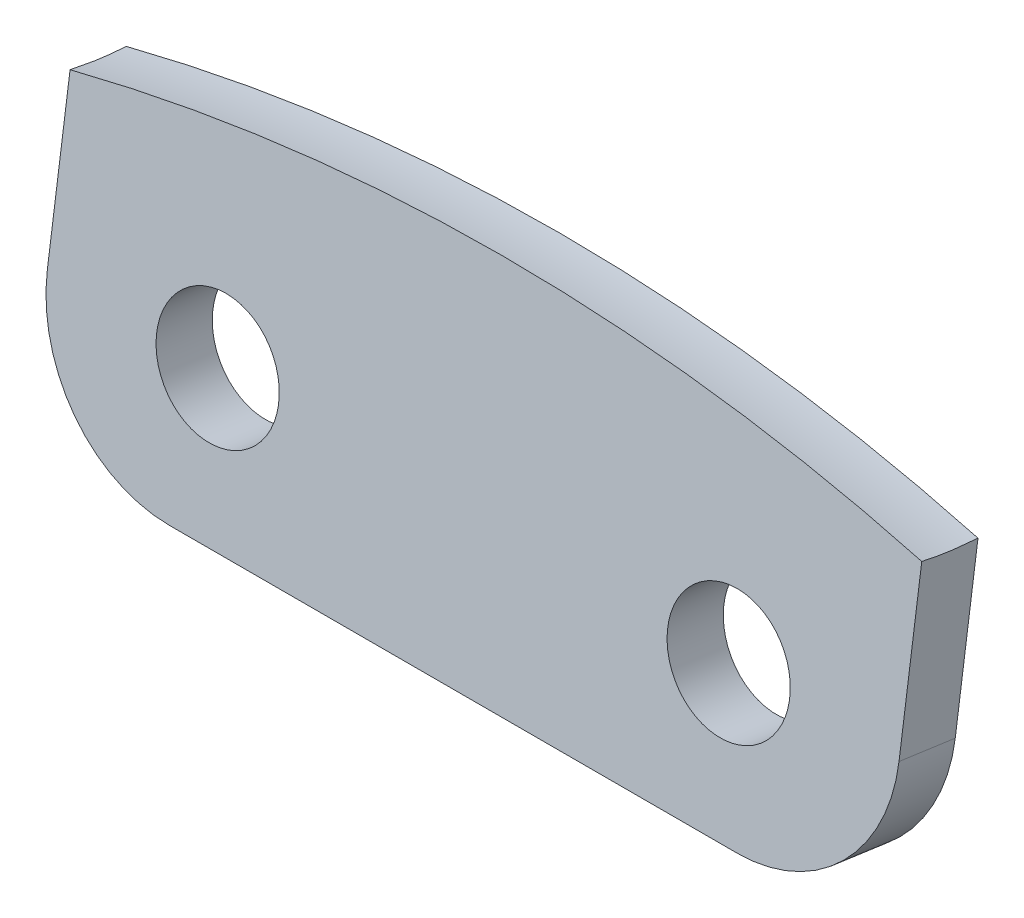
ISO-10303-21;
HEADER;
FILE_DESCRIPTION(('STEP AP214'),'2;1');
FILE_NAME('part.step','',(''),(''),'','','');
FILE_SCHEMA(('AUTOMOTIVE_DESIGN { 1 0 10303 214 1 1 1 1 }'));
ENDSEC;
DATA;
#1=APPLICATION_CONTEXT('core data for automotive mechanical design processes');
#2=APPLICATION_PROTOCOL_DEFINITION('international standard','automotive_design',2000,#1);
#3=PRODUCT_CONTEXT('',#1,'mechanical');
#4=PRODUCT('Part','Part','',(#3));
#5=PRODUCT_RELATED_PRODUCT_CATEGORY('part','',(#4));
#6=PRODUCT_DEFINITION_FORMATION('','',#4);
#7=PRODUCT_DEFINITION_CONTEXT('part definition',#1,'design');
#8=PRODUCT_DEFINITION('design','',#6,#7);
#9=PRODUCT_DEFINITION_SHAPE('','',#8);
#10=(LENGTH_UNIT() NAMED_UNIT(*) SI_UNIT(.MILLI.,.METRE.));
#11=(NAMED_UNIT(*) PLANE_ANGLE_UNIT() SI_UNIT($,.RADIAN.));
#12=(NAMED_UNIT(*) SI_UNIT($,.STERADIAN.) SOLID_ANGLE_UNIT());
#13=UNCERTAINTY_MEASURE_WITH_UNIT(LENGTH_MEASURE(1.E-05),#10,'distance_accuracy_value','');
#14=(GEOMETRIC_REPRESENTATION_CONTEXT(3) GLOBAL_UNCERTAINTY_ASSIGNED_CONTEXT((#13)) GLOBAL_UNIT_ASSIGNED_CONTEXT((#10,
#11,#12)) REPRESENTATION_CONTEXT('',''));
#15=CARTESIAN_POINT('',(0.,0.,0.));
#16=DIRECTION('',(0.,0.,1.));
#17=DIRECTION('',(1.,0.,0.));
#18=AXIS2_PLACEMENT_3D('',#15,#16,#17);
#19=CARTESIAN_POINT('',(-9.99999999999947,1160.19792613936,-1535.82954968714));
#20=DIRECTION('',(0.,-0.139147477143419,-0.990271669596087));
#21=DIRECTION('',(0.,0.990271669596087,-0.139147477143419));
#22=AXIS2_PLACEMENT_3D('',#19,#20,#21);
#23=CYLINDRICAL_SURFACE('',#22,4.99999999999995);
#24=DIRECTION('',(0.,-0.139147477143419,-0.990271669596087));
#25=VECTOR('',#24,1.);
#26=CARTESIAN_POINT('',(-14.9999999999995,1160.19792613936,-1535.82954968714));
#27=LINE('',#26,#25);
#28=CARTESIAN_POINT('',(-14.9999999999995,1160.19792613936,-1535.82954968714));
#29=VERTEX_POINT('',#28);
#30=CARTESIAN_POINT('',(-14.9999999999995,1159.91963118507,-1537.81009302633));
#31=VERTEX_POINT('',#30);
#32=EDGE_CURVE('E44',#29,#31,#27,.T.);
#33=ORIENTED_EDGE('',*,*,#32,.T.);
#34=CARTESIAN_POINT('',(-9.99999999999947,1159.91963118507,-1537.81009302633));
#35=DIRECTION('',(0.,-0.139147477143419,-0.990271669596087));
#36=DIRECTION('',(0.,-0.990271669596087,0.139147477143419));
#37=AXIS2_PLACEMENT_3D('',#34,#35,#36);
#38=CIRCLE('',#37,4.99999999999995);
#39=CARTESIAN_POINT('',(-9.99999999999947,1154.96827283709,-1537.11435564061));
#40=VERTEX_POINT('',#39);
#41=EDGE_CURVE('E102',#40,#31,#38,.T.);
#42=ORIENTED_EDGE('',*,*,#41,.F.);
#43=DIRECTION('',(0.,-0.139147477143419,-0.990271669596087));
#44=VECTOR('',#43,1.);
#45=CARTESIAN_POINT('',(-9.99999999999947,1155.24656779138,-1535.13381230142));
#46=LINE('',#45,#44);
#47=CARTESIAN_POINT('',(-9.99999999999947,1155.24656779138,-1535.13381230142));
#48=VERTEX_POINT('',#47);
#49=EDGE_CURVE('E127',#48,#40,#46,.T.);
#50=ORIENTED_EDGE('',*,*,#49,.F.);
#51=CARTESIAN_POINT('',(-9.99999999999947,1160.19792613936,-1535.82954968714));
#52=DIRECTION('',(0.,-0.139147477143419,-0.990271669596087));
#53=DIRECTION('',(0.,-0.990271669596087,0.139147477143419));
#54=AXIS2_PLACEMENT_3D('',#51,#52,#53);
#55=CIRCLE('',#54,4.99999999999995);
#56=EDGE_CURVE('E122',#48,#29,#55,.T.);
#57=ORIENTED_EDGE('',*,*,#56,.T.);
#58=EDGE_LOOP('',(#33,#42,#50,#57));
#59=FACE_BOUND('',#58,.T.);
#60=ADVANCED_FACE('F35',(#59),#23,.T.);
#61=CARTESIAN_POINT('',(-9.99999999999947,1155.24656779138,-1535.13381230142));
#62=DIRECTION('',(0.,-0.990271669596087,0.139147477143419));
#63=DIRECTION('',(0.,-0.139147477143419,-0.990271669596087));
#64=AXIS2_PLACEMENT_3D('',#61,#62,#63);
#65=PLANE('',#64);
#66=ORIENTED_EDGE('',*,*,#49,.T.);
#67=DIRECTION('',(-1.,0.,0.));
#68=VECTOR('',#67,1.);
#69=CARTESIAN_POINT('',(-9.99999999999947,1154.96827283709,-1537.11435564061));
#70=LINE('',#69,#68);
#71=CARTESIAN_POINT('',(10.0000000000005,1154.96827283709,-1537.11435564061));
#72=VERTEX_POINT('',#71);
#73=EDGE_CURVE('E108',#72,#40,#70,.T.);
#74=ORIENTED_EDGE('',*,*,#73,.F.);
#75=DIRECTION('',(0.,-0.139147477143419,-0.990271669596087));
#76=VECTOR('',#75,1.);
#77=CARTESIAN_POINT('',(10.0000000000005,1155.24656779138,-1535.13381230142));
#78=LINE('',#77,#76);
#79=CARTESIAN_POINT('',(10.0000000000005,1155.24656779138,-1535.13381230142));
#80=VERTEX_POINT('',#79);
#81=EDGE_CURVE('E129',#80,#72,#78,.T.);
#82=ORIENTED_EDGE('',*,*,#81,.F.);
#83=DIRECTION('',(-1.,0.,0.));
#84=VECTOR('',#83,1.);
#85=CARTESIAN_POINT('',(-9.99999999999947,1155.24656779138,-1535.13381230142));
#86=LINE('',#85,#84);
#87=EDGE_CURVE('E119',#80,#48,#86,.T.);
#88=ORIENTED_EDGE('',*,*,#87,.T.);
#89=EDGE_LOOP('',(#66,#74,#82,#88));
#90=FACE_BOUND('',#89,.T.);
#91=ADVANCED_FACE('F184',(#90),#65,.T.);
#92=CARTESIAN_POINT('',(10.0000000000005,1160.19792613936,-1535.82954968714));
#93=DIRECTION('',(0.,-0.139147477143419,-0.990271669596087));
#94=DIRECTION('',(0.,0.990271669596087,-0.139147477143419));
#95=AXIS2_PLACEMENT_3D('',#92,#93,#94);
#96=CYLINDRICAL_SURFACE('',#95,4.99999999999995);
#97=ORIENTED_EDGE('',*,*,#81,.T.);
#98=CARTESIAN_POINT('',(10.0000000000005,1159.91963118507,-1537.81009302633));
#99=DIRECTION('',(0.,-0.139147477143419,-0.990271669596087));
#100=DIRECTION('',(0.,-0.990271669596087,0.139147477143419));
#101=AXIS2_PLACEMENT_3D('',#98,#99,#100);
#102=CIRCLE('',#101,4.99999999999995);
#103=CARTESIAN_POINT('',(15.0000000000005,1159.91963118507,-1537.81009302633));
#104=VERTEX_POINT('',#103);
#105=EDGE_CURVE('E139',#104,#72,#102,.T.);
#106=ORIENTED_EDGE('',*,*,#105,.F.);
#107=DIRECTION('',(0.,-0.139147477143419,-0.990271669596087));
#108=VECTOR('',#107,1.);
#109=CARTESIAN_POINT('',(15.0000000000005,1160.19792613936,-1535.82954968714));
#110=LINE('',#109,#108);
#111=CARTESIAN_POINT('',(15.0000000000005,1160.19792613936,-1535.82954968714));
#112=VERTEX_POINT('',#111);
#113=EDGE_CURVE('E125',#112,#104,#110,.T.);
#114=ORIENTED_EDGE('',*,*,#113,.F.);
#115=CARTESIAN_POINT('',(10.0000000000005,1160.19792613936,-1535.82954968714));
#116=DIRECTION('',(0.,-0.139147477143419,-0.990271669596087));
#117=DIRECTION('',(0.,-0.990271669596087,0.139147477143419));
#118=AXIS2_PLACEMENT_3D('',#115,#116,#117);
#119=CIRCLE('',#118,4.99999999999995);
#120=EDGE_CURVE('E116',#112,#80,#119,.T.);
#121=ORIENTED_EDGE('',*,*,#120,.T.);
#122=EDGE_LOOP('',(#97,#106,#114,#121));
#123=FACE_BOUND('',#122,.T.);
#124=ADVANCED_FACE('F140',(#123),#96,.T.);
#125=CARTESIAN_POINT('',(9.00000000000053,1160.19792613936,-1535.82954968714));
#126=DIRECTION('',(0.,-0.139147477143419,-0.990271669596087));
#127=DIRECTION('',(0.,0.990271669596087,-0.139147477143419));
#128=AXIS2_PLACEMENT_3D('',#125,#126,#127);
#129=CYLINDRICAL_SURFACE('',#128,2.14999999999981);
#130=CARTESIAN_POINT('',(9.00000000000053,1160.19792613936,-1535.82954968714));
#131=DIRECTION('',(0.,-0.139147477143419,-0.990271669596087));
#132=DIRECTION('',(0.,0.990271669596087,-0.139147477143419));
#133=AXIS2_PLACEMENT_3D('',#130,#131,#132);
#134=CIRCLE('',#133,2.14999999999981);
#135=CARTESIAN_POINT('',(9.00000000000053,1162.32701022899,-1536.128716763));
#136=VERTEX_POINT('',#135);
#137=EDGE_CURVE('E103',#136,#136,#134,.T.);
#138=ORIENTED_EDGE('',*,*,#137,.F.);
#139=EDGE_LOOP('',(#138));
#140=FACE_BOUND('',#139,.T.);
#141=CARTESIAN_POINT('',(9.00000000000053,1159.91963118507,-1537.81009302633));
#142=DIRECTION('',(0.,-0.139147477143419,-0.990271669596087));
#143=DIRECTION('',(0.,0.990271669596087,-0.139147477143419));
#144=AXIS2_PLACEMENT_3D('',#141,#142,#143);
#145=CIRCLE('',#144,2.14999999999981);
#146=CARTESIAN_POINT('',(9.00000000000053,1162.0487152747,-1538.10926010219));
#147=VERTEX_POINT('',#146);
#148=EDGE_CURVE('E148',#147,#147,#145,.T.);
#149=ORIENTED_EDGE('',*,*,#148,.T.);
#150=EDGE_LOOP('',(#149));
#151=FACE_BOUND('',#150,.T.);
#152=ADVANCED_FACE('F171',(#140,#151),#129,.F.);
#153=CARTESIAN_POINT('',(-8.99999999999947,1160.19792613936,-1535.82954968714));
#154=DIRECTION('',(0.,-0.139147477143419,-0.990271669596087));
#155=DIRECTION('',(0.,0.990271669596087,-0.139147477143419));
#156=AXIS2_PLACEMENT_3D('',#153,#154,#155);
#157=CYLINDRICAL_SURFACE('',#156,2.14999999999978);
#158=CARTESIAN_POINT('',(-8.99999999999947,1160.19792613936,-1535.82954968714));
#159=DIRECTION('',(0.,-0.139147477143419,-0.990271669596087));
#160=DIRECTION('',(0.,0.990271669596087,-0.139147477143419));
#161=AXIS2_PLACEMENT_3D('',#158,#159,#160);
#162=CIRCLE('',#161,2.14999999999978);
#163=CARTESIAN_POINT('',(-8.99999999999947,1162.32701022899,-1536.128716763));
#164=VERTEX_POINT('',#163);
#165=EDGE_CURVE('E106',#164,#164,#162,.T.);
#166=ORIENTED_EDGE('',*,*,#165,.F.);
#167=EDGE_LOOP('',(#166));
#168=FACE_BOUND('',#167,.T.);
#169=CARTESIAN_POINT('',(-8.99999999999947,1159.91963118507,-1537.81009302633));
#170=DIRECTION('',(0.,-0.139147477143419,-0.990271669596087));
#171=DIRECTION('',(0.,0.990271669596087,-0.139147477143419));
#172=AXIS2_PLACEMENT_3D('',#169,#170,#171);
#173=CIRCLE('',#172,2.14999999999978);
#174=CARTESIAN_POINT('',(-8.99999999999947,1162.0487152747,-1538.10926010219));
#175=VERTEX_POINT('',#174);
#176=EDGE_CURVE('E143',#175,#175,#173,.T.);
#177=ORIENTED_EDGE('',*,*,#176,.T.);
#178=EDGE_LOOP('',(#177));
#179=FACE_BOUND('',#178,.T.);
#180=ADVANCED_FACE('F174',(#168,#179),#157,.F.);
#181=CARTESIAN_POINT('',(0.,1101.90768594367,-1527.63892875518));
#182=DIRECTION('',(0.,-0.139147477143419,-0.990271669596087));
#183=DIRECTION('',(0.,0.990271669596087,-0.139147477143419));
#184=AXIS2_PLACEMENT_3D('',#181,#182,#183);
#185=PLANE('',#184);
#186=ORIENTED_EDGE('',*,*,#165,.T.);
#187=EDGE_LOOP('',(#186));
#188=FACE_BOUND('',#187,.T.);
#189=ORIENTED_EDGE('',*,*,#137,.T.);
#190=EDGE_LOOP('',(#189));
#191=FACE_BOUND('',#190,.T.);
#192=CARTESIAN_POINT('',(0.,1101.90768594367,-1527.63892875518));
#193=DIRECTION('',(0.,0.139147477143419,0.990271669596087));
#194=DIRECTION('',(0.,-0.990271669596087,0.139147477143419));
#195=AXIS2_PLACEMENT_3D('',#192,#193,#194);
#196=CIRCLE('',#195,66.3394312923947);
#197=CARTESIAN_POINT('',(-14.9999999999995,1165.90038781815,-1536.63082794288));
#198=VERTEX_POINT('',#197);
#199=CARTESIAN_POINT('',(15.0000000000005,1165.90038781816,-1536.63082794287));
#200=VERTEX_POINT('',#199);
#201=EDGE_CURVE('E96',#198,#200,#196,.F.);
#202=ORIENTED_EDGE('',*,*,#201,.F.);
#203=DIRECTION('',(0.,0.990271669596086,-0.139147477143423));
#204=VECTOR('',#203,1.);
#205=CARTESIAN_POINT('',(-14.9999999999995,1178.71600636081,-1538.43160750972));
#206=LINE('',#205,#204);
#207=EDGE_CURVE('E95',#29,#198,#206,.T.);
#208=ORIENTED_EDGE('',*,*,#207,.F.);
#209=ORIENTED_EDGE('',*,*,#56,.F.);
#210=ORIENTED_EDGE('',*,*,#87,.F.);
#211=ORIENTED_EDGE('',*,*,#120,.F.);
#212=DIRECTION('',(0.,-0.990271669596086,0.139147477143423));
#213=VECTOR('',#212,1.);
#214=CARTESIAN_POINT('',(15.0000000000005,1160.19792613936,-1535.82954968714));
#215=LINE('',#214,#213);
#216=EDGE_CURVE('E114',#200,#112,#215,.T.);
#217=ORIENTED_EDGE('',*,*,#216,.F.);
#218=EDGE_LOOP('',(#202,#208,#209,#210,#211,#217));
#219=FACE_BOUND('',#218,.T.);
#220=ADVANCED_FACE('F169',(#188,#191,#219),#185,.F.);
#221=CARTESIAN_POINT('',(0.,1101.62939098938,-1529.61947209438));
#222=DIRECTION('',(0.,-0.139147477143419,-0.990271669596087));
#223=DIRECTION('',(0.,0.990271669596087,-0.139147477143419));
#224=AXIS2_PLACEMENT_3D('',#221,#222,#223);
#225=PLANE('',#224);
#226=ORIENTED_EDGE('',*,*,#176,.F.);
#227=EDGE_LOOP('',(#226));
#228=FACE_BOUND('',#227,.T.);
#229=ORIENTED_EDGE('',*,*,#148,.F.);
#230=EDGE_LOOP('',(#229));
#231=FACE_BOUND('',#230,.T.);
#232=DIRECTION('',(0.,0.990271669596086,-0.139147477143423));
#233=VECTOR('',#232,1.);
#234=CARTESIAN_POINT('',(-14.9999999999995,1178.43771140652,-1540.41215084891));
#235=LINE('',#234,#233);
#236=CARTESIAN_POINT('',(-14.9999999999995,1165.62209286387,-1538.61137128206));
#237=VERTEX_POINT('',#236);
#238=EDGE_CURVE('E93',#31,#237,#235,.T.);
#239=ORIENTED_EDGE('',*,*,#238,.T.);
#240=CARTESIAN_POINT('',(0.,1101.62939098938,-1529.61947209438));
#241=DIRECTION('',(0.,0.139147477143419,0.990271669596087));
#242=DIRECTION('',(0.,-0.990271669596087,0.139147477143419));
#243=AXIS2_PLACEMENT_3D('',#240,#241,#242);
#244=CIRCLE('',#243,66.3394312923947);
#245=CARTESIAN_POINT('',(15.0000000000005,1165.62209286387,-1538.61137128206));
#246=VERTEX_POINT('',#245);
#247=EDGE_CURVE('E11',#237,#246,#244,.F.);
#248=ORIENTED_EDGE('',*,*,#247,.T.);
#249=DIRECTION('',(0.,-0.990271669596086,0.139147477143423));
#250=VECTOR('',#249,1.);
#251=CARTESIAN_POINT('',(15.0000000000005,1159.91963118507,-1537.81009302633));
#252=LINE('',#251,#250);
#253=EDGE_CURVE('E134',#246,#104,#252,.T.);
#254=ORIENTED_EDGE('',*,*,#253,.T.);
#255=ORIENTED_EDGE('',*,*,#105,.T.);
#256=ORIENTED_EDGE('',*,*,#73,.T.);
#257=ORIENTED_EDGE('',*,*,#41,.T.);
#258=EDGE_LOOP('',(#239,#248,#254,#255,#256,#257));
#259=FACE_BOUND('',#258,.T.);
#260=ADVANCED_FACE('F99',(#228,#231,#259),#225,.T.);
#261=CARTESIAN_POINT('',(15.0000000000005,1160.19792613936,-1535.82954968714));
#262=DIRECTION('',(1.,0.,0.));
#263=DIRECTION('',(0.,0.,-1.));
#264=AXIS2_PLACEMENT_3D('',#261,#262,#263);
#265=PLANE('',#264);
#266=ORIENTED_EDGE('',*,*,#253,.F.);
#267=CARTESIAN_POINT('',(14.9999999998445,1165.67569151801,-1537.97772802715));
#268=CARTESIAN_POINT('',(14.9999999998576,1165.71413167356,-1537.62993234825));
#269=CARTESIAN_POINT('',(14.9999999999622,1165.7673359814,-1537.28381069675));
#270=CARTESIAN_POINT('',(15.0000000000388,1165.90290090622,-1536.59720776361));
#271=CARTESIAN_POINT('',(15.0000000000108,1165.98526923051,-1536.25672799791));
#272=CARTESIAN_POINT('',(14.9999999999902,1166.17862680393,-1535.5836119453));
#273=CARTESIAN_POINT('',(14.9999999999978,1166.28964627813,-1535.25098434886));
#274=CARTESIAN_POINT('',(15.0000000000033,1166.53939127691,-1534.5962972976));
#275=CARTESIAN_POINT('',(15.0000000000013,1166.67811696943,-1534.27423790685));
#276=CARTESIAN_POINT('',(14.9999999999998,1166.98201882941,-1533.64327821293));
#277=CARTESIAN_POINT('',(15.0000000000003,1167.14716665228,-1533.33436425248));
#278=CARTESIAN_POINT('',(15.0000000000007,1167.50273340793,-1532.73143851825));
#279=CARTESIAN_POINT('',(15.0000000000006,1167.69315270075,-1532.43742695686));
#280=CARTESIAN_POINT('',(15.0000000000005,1168.09775523604,-1531.86633721423));
#281=CARTESIAN_POINT('',(15.0000000000005,1168.31193338609,-1531.58925542396));
#282=CARTESIAN_POINT('',(15.0000000000005,1168.76247475977,-1531.05376225079));
#283=CARTESIAN_POINT('',(15.0000000000005,1168.99883812016,-1530.79535098298));
#284=CARTESIAN_POINT('',(15.0000000000005,1169.49490738974,-1530.29592500603));
#285=CARTESIAN_POINT('',(15.0000000000005,1169.75485477311,-1530.05515016193));
#286=CARTESIAN_POINT('',(15.0000000000005,1170.29376468047,-1529.59592098491));
#287=CARTESIAN_POINT('',(15.0000000000005,1170.5727273229,-1529.37746679103));
#288=CARTESIAN_POINT('',(15.0000000000005,1171.14769201205,-1528.96421057762));
#289=CARTESIAN_POINT('',(15.0000000000005,1171.44369577138,-1528.76941094149));
#290=CARTESIAN_POINT('',(15.0000000000005,1172.05064808343,-1528.40466267858));
#291=CARTESIAN_POINT('',(15.0000000000005,1172.3615972816,-1528.23471512637));
#292=CARTESIAN_POINT('',(15.0000000000005,1173.00377195314,-1527.91699047721));
#293=CARTESIAN_POINT('',(15.0000000000005,1173.33530246631,-1527.76982967673));
#294=CARTESIAN_POINT('',(15.0000000000005,1174.00942754683,-1527.5035152083));
#295=CARTESIAN_POINT('',(15.0000000000005,1174.35202227609,-1527.38436195041));
#296=CARTESIAN_POINT('',(15.0000000000005,1175.0459206675,-1527.17477793324));
#297=CARTESIAN_POINT('',(15.0000000000005,1175.397225132,-1527.08434983079));
#298=CARTESIAN_POINT('',(15.0000000000005,1176.10608930003,-1526.9327791809));
#299=CARTESIAN_POINT('',(15.0000000000005,1176.46364895158,-1526.87163639016));
#300=CARTESIAN_POINT('',(15.0000000000005,1177.18904721639,-1526.77817436675));
#301=CARTESIAN_POINT('',(15.0000000000005,1177.55695513025,-1526.7463922191));
#302=CARTESIAN_POINT('',(15.0000000000005,1178.29414301672,-1526.71376237699));
#303=CARTESIAN_POINT('',(15.0000000000005,1178.6634230071,-1526.71291508453));
#304=CARTESIAN_POINT('',(15.0000000000005,1179.40077009501,-1526.74216925309));
#305=CARTESIAN_POINT('',(15.0000000000005,1179.76883714662,-1526.77227187259));
#306=CARTESIAN_POINT('',(15.0000000000005,1180.50114898564,-1526.86324775765));
#307=CARTESIAN_POINT('',(15.0000000000005,1180.86539377523,-1526.9241210058));
#308=CARTESIAN_POINT('',(15.0000000000005,1181.58926091926,-1527.07663763578));
#309=CARTESIAN_POINT('',(15.0000000000005,1181.94885167621,-1527.16843107309));
#310=CARTESIAN_POINT('',(15.0000000000005,1182.65897571391,-1527.38212995158));
#311=CARTESIAN_POINT('',(15.0000000000005,1183.00950894431,-1527.50403556015));
#312=CARTESIAN_POINT('',(15.0000000000005,1183.69895808254,-1527.7771665892));
#313=CARTESIAN_POINT('',(15.0000000000005,1184.03787413581,-1527.92839164247));
#314=CARTESIAN_POINT('',(15.0000000000005,1184.70159290366,-1528.25916337438));
#315=CARTESIAN_POINT('',(15.0000000000005,1185.02639573216,-1528.43870982435));
#316=CARTESIAN_POINT('',(15.0000000000005,1185.65709172106,-1528.82346938354));
#317=CARTESIAN_POINT('',(15.0000000000005,1185.96310825934,-1529.02848024569));
#318=CARTESIAN_POINT('',(15.0000000000005,1186.55656749437,-1529.4638272311));
#319=CARTESIAN_POINT('',(15.0000000000005,1186.84401024382,-1529.6941632825));
#320=CARTESIAN_POINT('',(15.0000000000005,1187.39813110698,-1530.17856422385));
#321=CARTESIAN_POINT('',(15.0000000000005,1187.66481029611,-1530.43262788335));
#322=CARTESIAN_POINT('',(15.0000000000005,1188.17537027388,-1530.96271527129));
#323=CARTESIAN_POINT('',(15.0000000000005,1188.41925131561,-1531.2387387559));
#324=CARTESIAN_POINT('',(15.0000000000005,1188.87899232088,-1531.80667570285));
#325=CARTESIAN_POINT('',(15.0000000000005,1189.09520399305,-1532.0983045008));
#326=CARTESIAN_POINT('',(15.0000000000005,1189.50197195847,-1532.69893874431));
#327=CARTESIAN_POINT('',(15.0000000000005,1189.6925284678,-1533.00794404349));
#328=CARTESIAN_POINT('',(15.0000000000005,1190.04649056458,-1533.64110937629));
#329=CARTESIAN_POINT('',(15.0000000000005,1190.20989785517,-1533.96526845765));
#330=CARTESIAN_POINT('',(15.0000000000005,1190.50828417151,-1534.62641766991));
#331=CARTESIAN_POINT('',(15.0000000000005,1190.6432634697,-1534.96340767783));
#332=CARTESIAN_POINT('',(15.0000000000005,1190.88193164441,-1535.64268489962));
#333=CARTESIAN_POINT('',(15.0000000000005,1190.98605432864,-1535.98481974647));
#334=CARTESIAN_POINT('',(15.0000000000005,1191.1648372267,-1536.67670248095));
#335=CARTESIAN_POINT('',(15.0000000000005,1191.23949773209,-1537.02645029321));
#336=CARTESIAN_POINT('',(15.0000000000005,1191.35875291483,-1537.73101688258));
#337=CARTESIAN_POINT('',(15.0000000000005,1191.4033491555,-1538.08583539502));
#338=CARTESIAN_POINT('',(15.0000000000005,1191.46211089908,-1538.79798375041));
#339=CARTESIAN_POINT('',(15.0000000000005,1191.4762765632,-1539.15531358004));
#340=CARTESIAN_POINT('',(15.0000000000005,1191.47405427497,-1539.86613960264));
#341=CARTESIAN_POINT('',(15.0000000000005,1191.45798416398,-1540.21963682344));
#342=CARTESIAN_POINT('',(15.0000000000005,1191.39601362046,-1540.92400530222));
#343=CARTESIAN_POINT('',(15.0000000000005,1191.35011342294,-1541.27487658086));
#344=CARTESIAN_POINT('',(15.0000000000005,1191.22881165223,-1541.97147142336));
#345=CARTESIAN_POINT('',(15.0000000000005,1191.15341089665,-1542.3171951296));
#346=CARTESIAN_POINT('',(15.0000000000005,1190.97366056328,-1543.00103295483));
#347=CARTESIAN_POINT('',(15.0000000000005,1190.8693109899,-1543.33914707497));
#348=CARTESIAN_POINT('',(15.0000000000005,1190.63284294915,-1544.00421139382));
#349=CARTESIAN_POINT('',(15.0000000000005,1190.50082104285,-1544.33119593363));
#350=CARTESIAN_POINT('',(15.0000000000005,1190.20976885829,-1544.97291271301));
#351=CARTESIAN_POINT('',(15.0000000000005,1190.05073868044,-1545.28764499811));
#352=CARTESIAN_POINT('',(15.0000000000005,1189.70684127594,-1545.90266090304));
#353=CARTESIAN_POINT('',(15.0000000000005,1189.5219740152,-1546.2029445038));
#354=CARTESIAN_POINT('',(15.0000000000005,1189.12775929317,-1546.78698716372));
#355=CARTESIAN_POINT('',(15.0000000000005,1188.91841172123,-1547.07074614818));
#356=CARTESIAN_POINT('',(15.0000000000005,1188.4758194471,-1547.62097420524));
#357=CARTESIAN_POINT('',(15.0000000000005,1188.24247638468,-1547.88736415445));
#358=CARTESIAN_POINT('',(15.0000000000005,1187.75434634493,-1548.39971001104));
#359=CARTESIAN_POINT('',(15.0000000000005,1187.49955934071,-1548.64566589279));
#360=CARTESIAN_POINT('',(15.0000000000005,1186.97037781635,-1549.11550606473));
#361=CARTESIAN_POINT('',(15.0000000000005,1186.69598270618,-1549.33938969025));
#362=CARTESIAN_POINT('',(15.0000000000005,1186.12955737256,-1549.76360813256));
#363=CARTESIAN_POINT('',(15.0000000000005,1185.83752701018,-1549.96394276381));
#364=CARTESIAN_POINT('',(15.0000000000005,1185.23462198556,-1550.34182946894));
#365=CARTESIAN_POINT('',(15.0000000000005,1184.9235762576,-1550.51910862944));
#366=CARTESIAN_POINT('',(15.0000000000005,1184.28780369726,-1550.84714657885));
#367=CARTESIAN_POINT('',(15.0000000000005,1183.96307678432,-1550.99790521155));
#368=CARTESIAN_POINT('',(15.0000000000005,1183.30222119869,-1551.27197023865));
#369=CARTESIAN_POINT('',(15.0000000000005,1182.96609194655,-1551.39527523543));
#370=CARTESIAN_POINT('',(15.0000000000005,1182.28479386335,-1551.61368335557));
#371=CARTESIAN_POINT('',(15.0000000000005,1181.93962494886,-1551.70878621852));
#372=CARTESIAN_POINT('',(15.0000000000005,1181.23747149208,-1551.87143973654));
#373=CARTESIAN_POINT('',(15.0000000000005,1180.88038770073,-1551.93856209909));
#374=CARTESIAN_POINT('',(15.0000000000005,1180.16187186357,-1552.04283812932));
#375=CARTESIAN_POINT('',(15.0000000000005,1179.80043977802,-1552.07999152291));
#376=CARTESIAN_POINT('',(15.0000000000005,1179.0757168322,-1552.12416717621));
#377=CARTESIAN_POINT('',(15.0000000000005,1178.7124258518,-1552.13118746324));
#378=CARTESIAN_POINT('',(15.0000000000005,1177.98651069032,-1552.11512374963));
#379=CARTESIAN_POINT('',(15.0000000000005,1177.62388651445,-1552.0920395153));
#380=CARTESIAN_POINT('',(15.0000000000005,1176.89671536017,-1552.01545322497));
#381=CARTESIAN_POINT('',(15.0000000000005,1176.53221280897,-1551.96152886113));
#382=CARTESIAN_POINT('',(15.0000000000005,1175.80899560475,-1551.8233746693));
#383=CARTESIAN_POINT('',(15.0000000000005,1175.45028100922,-1551.73914454044));
#384=CARTESIAN_POINT('',(15.0000000000005,1174.74112935474,-1551.54098521138));
#385=CARTESIAN_POINT('',(15.0000000000005,1174.39069275195,-1551.42705437862));
#386=CARTESIAN_POINT('',(15.0000000000005,1173.7005722034,-1551.17029058067));
#387=CARTESIAN_POINT('',(15.0000000000005,1173.36088828337,-1551.02745754634));
#388=CARTESIAN_POINT('',(15.0000000000005,1172.69226818535,-1550.71273310204));
#389=CARTESIAN_POINT('',(15.0000000000005,1172.3634268487,-1550.54064013806));
#390=CARTESIAN_POINT('',(15.0000000000005,1171.72145053973,-1550.16929314626));
#391=CARTESIAN_POINT('',(15.0000000000005,1171.40831568102,-1549.970038922));
#392=CARTESIAN_POINT('',(15.0000000000005,1170.8000544247,-1549.54572691296));
#393=CARTESIAN_POINT('',(15.0000000000005,1170.50492754791,-1549.32066981524));
#394=CARTESIAN_POINT('',(15.0000000000005,1169.93487656548,-1548.84627699519));
#395=CARTESIAN_POINT('',(15.0000000000005,1169.65995229663,-1548.59694146902));
#396=CARTESIAN_POINT('',(15.0000000000005,1169.13385104348,-1548.07712621486));
#397=CARTESIAN_POINT('',(15.0000000000005,1168.88255208367,-1547.80676995583));
#398=CARTESIAN_POINT('',(15.0000000000005,1168.4039574465,-1547.24557763507));
#399=CARTESIAN_POINT('',(15.0000000000005,1168.17666185843,-1546.95474149717));
#400=CARTESIAN_POINT('',(15.0000000000005,1167.74785213967,-1546.35455440145));
#401=CARTESIAN_POINT('',(15.0000000000005,1167.54634306974,-1546.04519982672));
#402=CARTESIAN_POINT('',(15.0000000000005,1167.17083191383,-1545.41022876709));
#403=CARTESIAN_POINT('',(15.0000000000005,1166.99682890801,-1545.08461282648));
#404=CARTESIAN_POINT('',(15.0000000000006,1166.68072994581,-1544.42554567381));
#405=CARTESIAN_POINT('',(15.0000000000007,1166.53810957561,-1544.09234595534));
#406=CARTESIAN_POINT('',(15.0000000000003,1166.28204003209,-1543.41492219587));
#407=CARTESIAN_POINT('',(14.9999999999999,1166.16859018661,-1543.0706984091));
#408=CARTESIAN_POINT('',(15.0000000000012,1165.97199758281,-1542.3741552754));
#409=CARTESIAN_POINT('',(15.000000000003,1165.88881730054,-1542.0218465313));
#410=CARTESIAN_POINT('',(14.999999999998,1165.75336610673,-1541.3114613835));
#411=CARTESIAN_POINT('',(14.9999999999912,1165.70108598273,-1540.95338673156));
#412=CARTESIAN_POINT('',(15.0000000000117,1165.6203148259,-1540.15914369331));
#413=CARTESIAN_POINT('',(15.0000000000464,1165.59903387134,-1539.72222370769));
#414=CARTESIAN_POINT('',(14.9999999999546,1165.60273196936,-1538.84857577385));
#415=CARTESIAN_POINT('',(14.9999999998282,1165.62771037998,-1538.41184782306));
#416=CARTESIAN_POINT('',(14.9999999998445,1165.67569151801,-1537.97772802715));
#417=B_SPLINE_CURVE_WITH_KNOTS('',3,(#267,#268,#269,#270,#271,#272,#273,#274,#275,#276,#277,
#278,#279,#280,#281,#282,#283,#284,#285,#286,#287,#288,#289,#290,#291,#292,#293,#294,#295,#296,
#297,#298,#299,#300,#301,#302,#303,#304,#305,#306,#307,#308,#309,#310,#311,#312,#313,#314,#315,
#316,#317,#318,#319,#320,#321,#322,#323,#324,#325,#326,#327,#328,#329,#330,#331,#332,#333,#334,
#335,#336,#337,#338,#339,#340,#341,#342,#343,#344,#345,#346,#347,#348,#349,#350,#351,#352,#353,
#354,#355,#356,#357,#358,#359,#360,#361,#362,#363,#364,#365,#366,#367,#368,#369,#370,#371,#372,
#373,#374,#375,#376,#377,#378,#379,#380,#381,#382,#383,#384,#385,#386,#387,#388,#389,#390,#391,
#392,#393,#394,#395,#396,#397,#398,#399,#400,#401,#402,#403,#404,#405,#406,#407,#408,#409,#410,
#411,#412,#413,#414,#415,#416),.UNSPECIFIED.,.T.,.F.,(4,2,2,2,2,2,2,2,2,2,2,2,2,2,2,2,2,2,2,2,2,
2,2,2,2,2,2,2,2,2,2,2,2,2,2,2,2,2,2,2,2,2,2,2,2,2,2,2,2,2,2,2,2,2,2,2,2,2,2,2,2,2,2,2,2,2,2,2,2,
2,2,2,2,2,4),(0.,1.04935349695256,2.09898451858931,3.1497273901004,4.20047663116604,
5.25010613783146,6.2997505998049,7.34917051697137,8.39859690379266,9.4603441489187,
10.5220980078413,11.5839587590731,12.6458654108758,13.732777462977,14.8197054275148,
15.9067338944451,16.9937533308369,18.1002848290123,19.2068307064853,20.3134180038408,
21.4200046751593,22.532040886118,23.6440832789459,24.7561117451837,25.86813123339,
26.9718243931253,28.0755144211934,29.1791472467927,30.2827678196175,31.3705605325981,
32.4583440833141,33.5460593691585,34.6337642308204,35.7053600880753,36.776945340442,
37.8484748667877,38.9199987167387,39.9803214957449,41.040635921093,42.1009209614846,
43.1612058402557,44.2178507365794,45.2744917048153,46.3311340678245,47.3877812071507,
48.4489467534245,49.5101136302022,50.5713124517244,51.6325196333844,52.7053245231404,
53.7781357317064,54.8510015426194,55.9238772595542,57.0126205315985,58.1013737614987,
59.1901982664955,60.2790312236595,61.3831437881024,62.4872673133584,63.5914515416472,
64.6956384119402,65.8077647210867,66.9198990737896,68.0320038206821,69.1440995822998,
70.2500958847931,71.3560963011598,72.4623134452168,73.5684935881225,74.6544831710923,
75.7404477278199,76.8250614350458,77.9093516164868,79.219176537664,80.5289832821763),.UNSPECIFIED.);
#418=EDGE_CURVE('E51',#246,#200,#417,.T.);
#419=ORIENTED_EDGE('',*,*,#418,.T.);
#420=ORIENTED_EDGE('',*,*,#216,.T.);
#421=ORIENTED_EDGE('',*,*,#113,.T.);
#422=EDGE_LOOP('',(#266,#419,#420,#421));
#423=FACE_BOUND('',#422,.T.);
#424=ADVANCED_FACE('F37',(#423),#265,.T.);
#425=CARTESIAN_POINT('',(-14.9999999999995,1178.71600636081,-1538.43160750972));
#426=DIRECTION('',(-1.,0.,0.));
#427=DIRECTION('',(0.,0.,1.));
#428=AXIS2_PLACEMENT_3D('',#425,#426,#427);
#429=PLANE('',#428);
#430=ORIENTED_EDGE('',*,*,#207,.T.);
#431=CARTESIAN_POINT('',(-14.9999999998434,1165.67569151802,-1537.97772802715));
#432=CARTESIAN_POINT('',(-14.9999999998557,1165.63715288092,-1538.32636355573));
#433=CARTESIAN_POINT('',(-14.9999999999609,1165.61345855713,-1538.67660016209));
#434=CARTESIAN_POINT('',(-15.000000000038,1165.59587135092,-1539.37793603476));
#435=CARTESIAN_POINT('',(-15.0000000000098,1165.60198662114,-1539.72903551083));
#436=CARTESIAN_POINT('',(-14.9999999999891,1165.64395130027,-1540.42983121457));
#437=CARTESIAN_POINT('',(-14.9999999999967,1165.67983326859,-1540.77952548415));
#438=CARTESIAN_POINT('',(-15.0000000000022,1165.78101005591,-1541.47463386076));
#439=CARTESIAN_POINT('',(-15.0000000000002,1165.84630512451,-1541.82004793146));
#440=CARTESIAN_POINT('',(-14.9999999999987,1166.00561769531,-1542.50375127655));
#441=CARTESIAN_POINT('',(-14.9999999999993,1166.09960109027,-1542.8420485043));
#442=CARTESIAN_POINT('',(-14.9999999999997,1166.31550752599,-1543.50960721902));
#443=CARTESIAN_POINT('',(-14.9999999999995,1166.43743097084,-1543.83886857523));
#444=CARTESIAN_POINT('',(-14.9999999999994,1166.7081800903,-1544.48604778634));
#445=CARTESIAN_POINT('',(-14.9999999999995,1166.85699982685,-1544.80396812655));
#446=CARTESIAN_POINT('',(-14.9999999999995,1167.18037753467,-1545.42643348318));
#447=CARTESIAN_POINT('',(-14.9999999999995,1167.354935689,-1545.73097840445));
#448=CARTESIAN_POINT('',(-14.9999999999995,1167.73096150544,-1546.32869970165));
#449=CARTESIAN_POINT('',(-14.9999999999995,1167.93275884223,-1546.62166867622));
#450=CARTESIAN_POINT('',(-14.9999999999995,1168.35987971987,-1547.18991893983));
#451=CARTESIAN_POINT('',(-14.9999999999995,1168.58520343457,-1547.46520009815));
#452=CARTESIAN_POINT('',(-14.9999999999995,1169.05774146895,-1547.99633231963));
#453=CARTESIAN_POINT('',(-14.9999999999995,1169.3049580886,-1548.25218133607));
#454=CARTESIAN_POINT('',(-14.9999999999995,1169.81949942843,-1548.74280408956));
#455=CARTESIAN_POINT('',(-14.9999999999995,1170.08682499548,-1548.97757693808));
#456=CARTESIAN_POINT('',(-14.9999999999995,1170.64619892549,-1549.42980906243));
#457=CARTESIAN_POINT('',(-14.9999999999995,1170.93868001833,-1549.64673327162));
#458=CARTESIAN_POINT('',(-14.9999999999995,1171.54065139099,-1550.05553598914));
#459=CARTESIAN_POINT('',(-14.9999999999995,1171.85014192394,-1550.2474141246));
#460=CARTESIAN_POINT('',(-14.9999999999995,1172.48398248195,-1550.60488578009));
#461=CARTESIAN_POINT('',(-14.9999999999995,1172.80833380457,-1550.77047699925));
#462=CARTESIAN_POINT('',(-14.9999999999995,1173.46961441015,-1551.07426368069));
#463=CARTESIAN_POINT('',(-14.9999999999995,1173.80654355693,-1551.2124594395));
#464=CARTESIAN_POINT('',(-14.9999999999995,1174.49612442279,-1551.46251471063));
#465=CARTESIAN_POINT('',(-14.9999999999995,1174.84894111675,-1551.57391952431));
#466=CARTESIAN_POINT('',(-14.9999999999995,1175.56268419713,-1551.76671933081));
#467=CARTESIAN_POINT('',(-14.9999999999995,1175.92361068046,-1551.84811396486));
#468=CARTESIAN_POINT('',(-14.9999999999995,1176.65103751092,-1551.98029451969));
#469=CARTESIAN_POINT('',(-14.9999999999995,1177.01753801193,-1552.03107959389));
#470=CARTESIAN_POINT('',(-14.9999999999995,1177.75351313257,-1552.10162921577));
#471=CARTESIAN_POINT('',(-14.9999999999995,1178.12298774585,-1552.1213938296));
#472=CARTESIAN_POINT('',(-14.9999999999995,1178.86320334258,-1552.1297030161));
#473=CARTESIAN_POINT('',(-14.9999999999995,1179.23394520046,-1552.11817039009));
#474=CARTESIAN_POINT('',(-14.9999999999995,1179.97312041655,-1552.06371510339));
#475=CARTESIAN_POINT('',(-14.9999999999995,1180.34155376551,-1552.02079231719));
#476=CARTESIAN_POINT('',(-14.9999999999995,1181.07342980255,-1551.90376613103));
#477=CARTESIAN_POINT('',(-14.9999999999995,1181.43687259473,-1551.82966338255));
#478=CARTESIAN_POINT('',(-14.9999999999995,1182.15610731814,-1551.65070488613));
#479=CARTESIAN_POINT('',(-14.9999999999995,1182.51189931806,-1551.54584941439));
#480=CARTESIAN_POINT('',(-14.9999999999995,1183.20996886002,-1551.30713991212));
#481=CARTESIAN_POINT('',(-14.9999999999995,1183.55234053073,-1551.17356114357));
#482=CARTESIAN_POINT('',(-14.9999999999995,1184.22445533907,-1550.87770674711));
#483=CARTESIAN_POINT('',(-14.9999999999995,1184.55419852858,-1550.71543123714));
#484=CARTESIAN_POINT('',(-14.9999999999995,1185.1985735444,-1550.36326682543));
#485=CARTESIAN_POINT('',(-14.9999999999995,1185.51320621346,-1550.17337946608));
#486=CARTESIAN_POINT('',(-14.9999999999995,1186.1249969858,-1549.76727744671));
#487=CARTESIAN_POINT('',(-14.9999999999995,1186.42215528346,-1549.55106307964));
#488=CARTESIAN_POINT('',(-14.9999999999995,1186.99244846716,-1549.09721675926));
#489=CARTESIAN_POINT('',(-14.9999999999995,1187.26587482239,-1548.85995099838));
#490=CARTESIAN_POINT('',(-14.9999999999995,1187.79150623817,-1548.36297269437));
#491=CARTESIAN_POINT('',(-14.9999999999995,1188.04371148941,-1548.10326035298));
#492=CARTESIAN_POINT('',(-14.9999999999995,1188.52497158301,-1547.56323211329));
#493=CARTESIAN_POINT('',(-14.9999999999995,1188.75402786437,-1547.28291749755));
#494=CARTESIAN_POINT('',(-14.9999999999995,1189.18725299366,-1546.70367358305));
#495=CARTESIAN_POINT('',(-14.9999999999995,1189.39142206461,-1546.40474445113));
#496=CARTESIAN_POINT('',(-14.9999999999995,1189.77056195393,-1545.79484008639));
#497=CARTESIAN_POINT('',(-14.9999999999995,1189.94590915485,-1545.48409876846));
#498=CARTESIAN_POINT('',(-14.9999999999995,1190.26957544958,-1544.84884551279));
#499=CARTESIAN_POINT('',(-14.9999999999995,1190.41789480709,-1544.52433370944));
#500=CARTESIAN_POINT('',(-14.9999999999995,1190.68638000635,-1543.86388316612));
#501=CARTESIAN_POINT('',(-14.9999999999995,1190.80654721035,-1543.52794497998));
#502=CARTESIAN_POINT('',(-14.9999999999995,1191.01783073939,-1542.84705369763));
#503=CARTESIAN_POINT('',(-14.9999999999995,1191.10894719218,-1542.50210064107));
#504=CARTESIAN_POINT('',(-14.9999999999995,1191.26073402729,-1541.80893784545));
#505=CARTESIAN_POINT('',(-14.9999999999995,1191.32168073988,-1541.46078858647));
#506=CARTESIAN_POINT('',(-14.9999999999995,1191.4139524206,-1540.76058823376));
#507=CARTESIAN_POINT('',(-14.9999999999995,1191.44527760359,-1540.40853716835));
#508=CARTESIAN_POINT('',(-14.9999999999995,1191.47809131498,-1539.70305603435));
#509=CARTESIAN_POINT('',(-14.9999999999995,1191.47958051988,-1539.34962599721));
#510=CARTESIAN_POINT('',(-14.9999999999995,1191.45273695943,-1538.64390059971));
#511=CARTESIAN_POINT('',(-14.9999999999995,1191.4244041719,-1538.29160524019));
#512=CARTESIAN_POINT('',(-14.9999999999995,1191.33824498731,-1537.59137772749));
#513=CARTESIAN_POINT('',(-14.9999999999995,1191.28047940455,-1537.24343808727));
#514=CARTESIAN_POINT('',(-14.9999999999995,1191.13594664185,-1536.55363797523));
#515=CARTESIAN_POINT('',(-14.9999999999995,1191.04917954474,-1536.21177748605));
#516=CARTESIAN_POINT('',(-14.9999999999995,1190.84731595634,-1535.53652497705));
#517=CARTESIAN_POINT('',(-14.9999999999995,1190.73221927913,-1535.20313301283));
#518=CARTESIAN_POINT('',(-14.9999999999995,1190.47457467036,-1534.54713155027));
#519=CARTESIAN_POINT('',(-14.9999999999995,1190.33202659511,-1534.22452210838));
#520=CARTESIAN_POINT('',(-14.9999999999995,1190.01968036891,-1533.59053416572));
#521=CARTESIAN_POINT('',(-14.9999999999995,1189.84973441295,-1533.27922848719));
#522=CARTESIAN_POINT('',(-14.9999999999995,1189.4844427901,-1532.67189738041));
#523=CARTESIAN_POINT('',(-14.9999999999995,1189.28909706898,-1532.37587198477));
#524=CARTESIAN_POINT('',(-14.9999999999995,1188.87444440944,-1531.80109512165));
#525=CARTESIAN_POINT('',(-14.9999999999995,1188.65513664081,-1531.5223442532));
#526=CARTESIAN_POINT('',(-14.9999999999995,1188.19416573335,-1530.98398602434));
#527=CARTESIAN_POINT('',(-14.9999999999995,1187.95250240929,-1530.72437882259));
#528=CARTESIAN_POINT('',(-14.9999999999995,1187.44556585991,-1530.22305353797));
#529=CARTESIAN_POINT('',(-14.9999999999995,1187.18004638685,-1529.98158444116));
#530=CARTESIAN_POINT('',(-14.9999999999995,1186.62982767764,-1529.52159131832));
#531=CARTESIAN_POINT('',(-14.9999999999995,1186.34512831488,-1529.30306744377));
#532=CARTESIAN_POINT('',(-14.9999999999995,1185.75857338741,-1528.89037423448));
#533=CARTESIAN_POINT('',(-14.9999999999995,1185.45671689888,-1528.69620621297));
#534=CARTESIAN_POINT('',(-14.9999999999995,1184.83799300011,-1528.33347730025));
#535=CARTESIAN_POINT('',(-14.9999999999995,1184.52112545169,-1528.16491664482));
#536=CARTESIAN_POINT('',(-14.9999999999995,1183.86972026364,-1527.8521235844));
#537=CARTESIAN_POINT('',(-14.9999999999995,1183.53498849646,-1527.7082953688));
#538=CARTESIAN_POINT('',(-14.9999999999995,1182.85470682104,-1527.44902589879));
#539=CARTESIAN_POINT('',(-14.9999999999995,1182.50915681007,-1527.33358491407));
#540=CARTESIAN_POINT('',(-14.9999999999995,1181.80963914611,-1527.13180327528));
#541=CARTESIAN_POINT('',(-14.9999999999995,1181.45567094174,-1527.04546453303));
#542=CARTESIAN_POINT('',(-14.9999999999995,1180.74179628573,-1526.90242583132));
#543=CARTESIAN_POINT('',(-14.9999999999995,1180.3818897918,-1526.84572608297));
#544=CARTESIAN_POINT('',(-14.9999999999995,1179.65381144906,-1526.76175186911));
#545=CARTESIAN_POINT('',(-14.9999999999995,1179.28559331369,-1526.73487828601));
#546=CARTESIAN_POINT('',(-14.9999999999995,1178.54819836837,-1526.71207282427));
#547=CARTESIAN_POINT('',(-14.9999999999995,1178.17902154914,-1526.71614124626));
#548=CARTESIAN_POINT('',(-14.9999999999995,1177.44228683561,-1526.75518811986));
#549=CARTESIAN_POINT('',(-14.9999999999995,1177.07472902354,-1526.79016812372));
#550=CARTESIAN_POINT('',(-14.9999999999995,1176.34383868394,-1526.89081689958));
#551=CARTESIAN_POINT('',(-14.9999999999995,1175.98050616054,-1526.95648570161));
#552=CARTESIAN_POINT('',(-14.9999999999995,1175.25872551793,-1527.11852912382));
#553=CARTESIAN_POINT('',(-14.9999999999995,1174.90031352519,-1527.21506475395));
#554=CARTESIAN_POINT('',(-14.9999999999995,1174.19294110916,-1527.43812431475));
#555=CARTESIAN_POINT('',(-14.9999999999995,1173.84398074489,-1527.56464843265));
#556=CARTESIAN_POINT('',(-14.9999999999995,1173.15807699501,-1527.84687325501));
#557=CARTESIAN_POINT('',(-14.9999999999995,1172.821133142,-1528.00257282319));
#558=CARTESIAN_POINT('',(-14.9999999999995,1172.1617541722,-1528.34214789774));
#559=CARTESIAN_POINT('',(-14.9999999999995,1171.83931891035,-1528.52602312231));
#560=CARTESIAN_POINT('',(-14.9999999999995,1171.21392344105,-1528.91915856217));
#561=CARTESIAN_POINT('',(-14.9999999999995,1170.9108275625,-1529.12820292623));
#562=CARTESIAN_POINT('',(-14.9999999999995,1170.32362467989,-1529.57145892464));
#563=CARTESIAN_POINT('',(-14.9999999999995,1170.03951771392,-1529.80567060947));
#564=CARTESIAN_POINT('',(-14.9999999999995,1169.49246493397,-1530.29772864818));
#565=CARTESIAN_POINT('',(-14.9999999999995,1169.22952300877,-1530.55557932686));
#566=CARTESIAN_POINT('',(-14.9999999999995,1168.72697309209,-1531.09309049091));
#567=CARTESIAN_POINT('',(-14.9999999999994,1168.48736429264,-1531.37275022048));
#568=CARTESIAN_POINT('',(-14.9999999999995,1168.03799284486,-1531.94609049628));
#569=CARTESIAN_POINT('',(-14.9999999999997,1167.82772824633,-1532.23937767798));
#570=CARTESIAN_POINT('',(-14.9999999999993,1167.43318584949,-1532.84293663427));
#571=CARTESIAN_POINT('',(-14.9999999999988,1167.24890745975,-1533.15320802208));
#572=CARTESIAN_POINT('',(-15.0000000000001,1166.90805853918,-1533.78812427914));
#573=CARTESIAN_POINT('',(-15.000000000002,1166.75145370624,-1534.11275072164));
#574=CARTESIAN_POINT('',(-14.999999999997,1166.46701617564,-1534.77424143595));
#575=CARTESIAN_POINT('',(-14.9999999999901,1166.33917488351,-1535.11110201721));
#576=CARTESIAN_POINT('',(-15.0000000000107,1166.09083258593,-1535.8625705553));
#577=CARTESIAN_POINT('',(-15.0000000000451,1165.97682310776,-1536.27934095519));
#578=CARTESIAN_POINT('',(-14.9999999999539,1165.79295408595,-1537.1225095886));
#579=CARTESIAN_POINT('',(-14.9999999998283,1165.72309389205,-1537.54890768024));
#580=CARTESIAN_POINT('',(-14.9999999998434,1165.67569151802,-1537.97772802715));
#581=B_SPLINE_CURVE_WITH_KNOTS('',3,(#431,#432,#433,#434,#435,#436,#437,#438,#439,#440,#441,
#442,#443,#444,#445,#446,#447,#448,#449,#450,#451,#452,#453,#454,#455,#456,#457,#458,#459,#460,
#461,#462,#463,#464,#465,#466,#467,#468,#469,#470,#471,#472,#473,#474,#475,#476,#477,#478,#479,
#480,#481,#482,#483,#484,#485,#486,#487,#488,#489,#490,#491,#492,#493,#494,#495,#496,#497,#498,
#499,#500,#501,#502,#503,#504,#505,#506,#507,#508,#509,#510,#511,#512,#513,#514,#515,#516,#517,
#518,#519,#520,#521,#522,#523,#524,#525,#526,#527,#528,#529,#530,#531,#532,#533,#534,#535,#536,
#537,#538,#539,#540,#541,#542,#543,#544,#545,#546,#547,#548,#549,#550,#551,#552,#553,#554,#555,
#556,#557,#558,#559,#560,#561,#562,#563,#564,#565,#566,#567,#568,#569,#570,#571,#572,#573,#574,
#575,#576,#577,#578,#579,#580),.UNSPECIFIED.,.T.,.F.,(4,2,2,2,2,2,2,2,2,2,2,2,2,2,2,2,2,2,2,2,2,
2,2,2,2,2,2,2,2,2,2,2,2,2,2,2,2,2,2,2,2,2,2,2,2,2,2,2,2,2,2,2,2,2,2,2,2,2,2,2,2,2,2,2,2,2,2,2,2,
2,2,2,2,2,4),(0.,1.05189273121268,2.10407316176975,3.15740600830628,4.21074779383347,
5.26284211872065,6.31495166101188,7.36682920635782,8.41871423359282,9.48471491372332,
10.5507234712042,11.6168441515737,12.6830097556448,13.7741754820589,14.8653574510415,
15.9566348771731,17.0479004905266,18.1565532670029,19.2652192967728,20.3739159878265,
21.4826103151436,22.594041864103,23.7054778563239,24.816890626757,25.928293415591,
27.029485664273,28.1306733878996,29.2317996234845,30.332913607835,31.4176578129924,
32.5023922699554,33.5870592554223,34.6717165198746,35.7408354084795,36.8099438655825,
37.879000578801,38.9480525911749,40.0071229098811,41.0661855467886,42.1252241702399,
43.1842635811504,44.2411236162208,45.2979806328824,46.3548445854789,47.4117140701564,
48.4744886309148,49.5372654605928,50.6000791236806,51.6629015939389,52.7383426110731,
53.8137907272186,54.8892968044962,55.9648127834407,57.0565105150992,58.1482186175804,
59.2399984236207,60.3317860059342,61.438076593247,62.5443779292236,63.6507348218809,
64.7570927969125,65.8693186623823,66.9815514719704,68.0937409729814,69.2059193504913,
70.3091609182676,71.4124046989255,72.5158507247917,73.6192585279268,74.7005507344392,
75.7818183272501,76.8617361125426,77.9413307912474,79.2351738248172,80.528997801215),.UNSPECIFIED.);
#582=EDGE_CURVE('E87',#198,#237,#581,.T.);
#583=ORIENTED_EDGE('',*,*,#582,.T.);
#584=ORIENTED_EDGE('',*,*,#238,.F.);
#585=ORIENTED_EDGE('',*,*,#32,.F.);
#586=EDGE_LOOP('',(#430,#583,#584,#585));
#587=FACE_BOUND('',#586,.T.);
#588=ADVANCED_FACE('F92',(#587),#429,.T.);
#589=CARTESIAN_POINT('',(0.,1101.76853846653,-1528.62920042478));
#590=DIRECTION('',(0.,-0.139147477143419,-0.990271669596087));
#591=DIRECTION('',(0.,-0.990271669596087,0.13914747714342));
#592=AXIS2_PLACEMENT_3D('',#589,#590,#591);
#593=TOROIDAL_SURFACE('',#592,79.0000000000003,12.7000000000001);
#594=ORIENTED_EDGE('',*,*,#201,.T.);
#595=ORIENTED_EDGE('',*,*,#418,.F.);
#596=ORIENTED_EDGE('',*,*,#247,.F.);
#597=ORIENTED_EDGE('',*,*,#582,.F.);
#598=EDGE_LOOP('',(#594,#595,#596,#597));
#599=FACE_BOUND('',#598,.T.);
#600=ADVANCED_FACE('F86',(#599),#593,.F.);
#601=CLOSED_SHELL('',(#60,#91,#124,#152,#180,#220,#260,#424,#588,#600));
#602=MANIFOLD_SOLID_BREP('B2',#601);
#603=ADVANCED_BREP_SHAPE_REPRESENTATION('',(#18,#602),#14);
#604=SHAPE_DEFINITION_REPRESENTATION(#9,#603);
ENDSEC;
END-ISO-10303-21;
